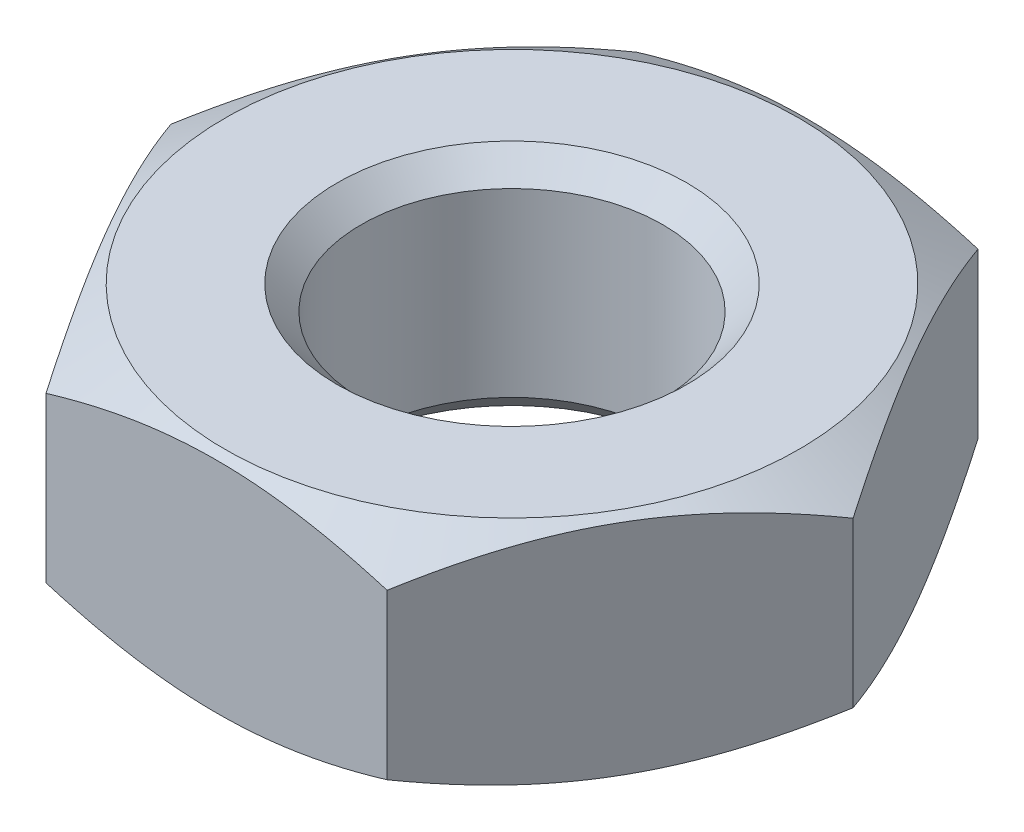
ISO-10303-21;
HEADER;
FILE_DESCRIPTION(('STEP AP214'),'2;1');
FILE_NAME('part.step','',(''),(''),'','','');
FILE_SCHEMA(('AUTOMOTIVE_DESIGN { 1 0 10303 214 1 1 1 1 }'));
ENDSEC;
DATA;
#1=APPLICATION_CONTEXT('core data for automotive mechanical design processes');
#2=APPLICATION_PROTOCOL_DEFINITION('international standard','automotive_design',2000,#1);
#3=PRODUCT_CONTEXT('',#1,'mechanical');
#4=PRODUCT('Part','Part','',(#3));
#5=PRODUCT_RELATED_PRODUCT_CATEGORY('part','',(#4));
#6=PRODUCT_DEFINITION_FORMATION('','',#4);
#7=PRODUCT_DEFINITION_CONTEXT('part definition',#1,'design');
#8=PRODUCT_DEFINITION('design','',#6,#7);
#9=PRODUCT_DEFINITION_SHAPE('','',#8);
#10=(LENGTH_UNIT() NAMED_UNIT(*) SI_UNIT(.MILLI.,.METRE.));
#11=(NAMED_UNIT(*) PLANE_ANGLE_UNIT() SI_UNIT($,.RADIAN.));
#12=(NAMED_UNIT(*) SI_UNIT($,.STERADIAN.) SOLID_ANGLE_UNIT());
#13=UNCERTAINTY_MEASURE_WITH_UNIT(LENGTH_MEASURE(1.E-05),#10,'distance_accuracy_value','');
#14=(GEOMETRIC_REPRESENTATION_CONTEXT(3) GLOBAL_UNCERTAINTY_ASSIGNED_CONTEXT((#13)) GLOBAL_UNIT_ASSIGNED_CONTEXT((#10,
#11,#12)) REPRESENTATION_CONTEXT('',''));
#15=CARTESIAN_POINT('',(0.,0.,0.));
#16=DIRECTION('',(0.,0.,1.));
#17=DIRECTION('',(1.,0.,0.));
#18=AXIS2_PLACEMENT_3D('',#15,#16,#17);
#19=CARTESIAN_POINT('',(2.82901631902917,1.9,0.));
#20=DIRECTION('',(-0.866025403784439,0.,0.5));
#21=DIRECTION('',(0.5,0.,0.866025403784439));
#22=AXIS2_PLACEMENT_3D('',#19,#20,#21);
#23=PLANE('',#22);
#24=CARTESIAN_POINT('',(1.41439268946075,0.269479077691386,-2.4502));
#25=CARTESIAN_POINT('',(1.47677048727323,0.232037910406293,-2.34215848492451));
#26=CARTESIAN_POINT('',(1.53972982554804,0.197971428797421,-2.23310971222164));
#27=CARTESIAN_POINT('',(1.66682980742826,0.138523898437332,-2.012966085964));
#28=CARTESIAN_POINT('',(1.73097313207265,0.1131660291326,-1.90186658871354));
#29=CARTESIAN_POINT('',(1.85840058422626,0.0738243493865201,-1.68115576730444));
#30=CARTESIAN_POINT('',(1.92166178982028,0.0595544012183872,-1.57158414506753));
#31=CARTESIAN_POINT('',(2.04849895824281,0.0426896534368349,-1.35189572507154));
#32=CARTESIAN_POINT('',(2.11207437813323,0.0400790531879413,-1.24177986770881));
#33=CARTESIAN_POINT('',(2.23032522857202,0.0462962306337335,-1.03696338671059));
#34=CARTESIAN_POINT('',(2.28502252294005,0.0536006980268142,-0.942224893828605));
#35=CARTESIAN_POINT('',(2.39403070515459,0.0764915330489983,-0.753417183792306));
#36=CARTESIAN_POINT('',(2.44834114841855,0.0920862332349296,-0.659348736677532));
#37=CARTESIAN_POINT('',(2.55758561799563,0.130973350090561,-0.470131764924119));
#38=CARTESIAN_POINT('',(2.61250370477718,0.154440199924583,-0.375010848364003));
#39=CARTESIAN_POINT('',(2.72146175961591,0.207610235260091,-0.186289961489444));
#40=CARTESIAN_POINT('',(2.77550335145968,0.237300005792712,-0.0926871786941389));
#41=CARTESIAN_POINT('',(2.829131789083,0.269479077691386,0.000200000000000194));
#42=B_SPLINE_CURVE_WITH_KNOTS('',3,(#24,#25,#26,#27,#28,#29,#30,#31,#32,#33,#34,#35,#36,#37,#38,
#39,#40,#41),.UNSPECIFIED.,.F.,.F.,(4,2,2,2,2,2,2,2,4),(0.,0.390930451950395,0.782893510352567,
1.16437050859214,1.54533037571847,1.87391217020586,2.20282485015241,2.53956853532258,
2.87559362214075),.UNSPECIFIED.);
#43=CARTESIAN_POINT('',(1.41450815951458,0.269409791417499,-2.45));
#44=VERTEX_POINT('',#43);
#45=CARTESIAN_POINT('',(2.82901631902917,0.269409791417499,0.));
#46=VERTEX_POINT('',#45);
#47=EDGE_CURVE('E47',#44,#46,#42,.T.);
#48=ORIENTED_EDGE('',*,*,#47,.F.);
#49=DIRECTION('',(0.,-1.,0.));
#50=VECTOR('',#49,1.);
#51=CARTESIAN_POINT('',(1.41450815951458,1.9,-2.45));
#52=LINE('',#51,#50);
#53=CARTESIAN_POINT('',(1.41450815951458,1.6305902085825,-2.45));
#54=VERTEX_POINT('',#53);
#55=EDGE_CURVE('E117',#54,#44,#52,.T.);
#56=ORIENTED_EDGE('',*,*,#55,.F.);
#57=CARTESIAN_POINT('',(2.829131789083,1.63052092230861,0.000199999999999789));
#58=CARTESIAN_POINT('',(2.76675399127052,1.66796208959371,-0.107841515075488));
#59=CARTESIAN_POINT('',(2.70379465299571,1.70202857120258,-0.216890287778362));
#60=CARTESIAN_POINT('',(2.57669467111549,1.76147610156267,-0.437033914036));
#61=CARTESIAN_POINT('',(2.5125513464711,1.7868339708674,-0.548133411286461));
#62=CARTESIAN_POINT('',(2.38512389431749,1.82617565061348,-0.768844232695565));
#63=CARTESIAN_POINT('',(2.32186268872347,1.84044559878161,-0.878415854932469));
#64=CARTESIAN_POINT('',(2.19502552030094,1.85731034656316,-1.09810427492846));
#65=CARTESIAN_POINT('',(2.13145010041052,1.85992094681206,-1.20822013229119));
#66=CARTESIAN_POINT('',(2.01319924997173,1.85370376936627,-1.41303661328941));
#67=CARTESIAN_POINT('',(1.95850195560369,1.84639930197319,-1.5077751061714));
#68=CARTESIAN_POINT('',(1.84949377338916,1.823508466951,-1.69658281620769));
#69=CARTESIAN_POINT('',(1.7951833301252,1.80791376676507,-1.79065126332247));
#70=CARTESIAN_POINT('',(1.68593886054812,1.76902664990944,-1.97986823507588));
#71=CARTESIAN_POINT('',(1.63102077376657,1.74555980007542,-2.074989151636));
#72=CARTESIAN_POINT('',(1.52206271892784,1.69238976473991,-2.26371003851056));
#73=CARTESIAN_POINT('',(1.46802112708407,1.66269999420729,-2.35731282130586));
#74=CARTESIAN_POINT('',(1.41439268946075,1.63052092230861,-2.4502));
#75=B_SPLINE_CURVE_WITH_KNOTS('',3,(#57,#58,#59,#60,#61,#62,#63,#64,#65,#66,#67,#68,#69,#70,#71,
#72,#73,#74),.UNSPECIFIED.,.F.,.F.,(4,2,2,2,2,2,2,2,4),(0.,0.390930451950395,0.782893510352568,
1.16437050859214,1.54533037571847,1.87391217020586,2.20282485015241,2.53956853532257,
2.87559362214075),.UNSPECIFIED.);
#76=CARTESIAN_POINT('',(2.82901631902917,1.6305902085825,0.));
#77=VERTEX_POINT('',#76);
#78=EDGE_CURVE('E108',#77,#54,#75,.T.);
#79=ORIENTED_EDGE('',*,*,#78,.F.);
#80=DIRECTION('',(0.,-1.,0.));
#81=VECTOR('',#80,1.);
#82=CARTESIAN_POINT('',(2.82901631902917,1.9,0.));
#83=LINE('',#82,#81);
#84=EDGE_CURVE('E104',#77,#46,#83,.T.);
#85=ORIENTED_EDGE('',*,*,#84,.T.);
#86=EDGE_LOOP('',(#48,#56,#79,#85));
#87=FACE_BOUND('',#86,.T.);
#88=ADVANCED_FACE('F32',(#87),#23,.F.);
#89=CARTESIAN_POINT('',(1.41450815951458,1.9,-2.45));
#90=DIRECTION('',(0.,0.,1.));
#91=DIRECTION('',(1.,0.,0.));
#92=AXIS2_PLACEMENT_3D('',#89,#90,#91);
#93=PLANE('',#92);
#94=CARTESIAN_POINT('',(-3.74965817158845,1.25946667055679,-2.45));
#95=CARTESIAN_POINT('',(-3.64345047094786,1.20613510680058,-2.45));
#96=CARTESIAN_POINT('',(-3.53697874802981,1.15332005100741,-2.45));
#97=CARTESIAN_POINT('',(-3.32336592279351,1.0490154886803,-2.45));
#98=CARTESIAN_POINT('',(-3.2162247078537,0.99752621305883,-2.45));
#99=CARTESIAN_POINT('',(-3.00051382017138,0.895876027771141,-2.45));
#100=CARTESIAN_POINT('',(-2.89193942229057,0.845725109514678,-2.45));
#101=CARTESIAN_POINT('',(-2.67385403861369,0.74751083227892,-2.45));
#102=CARTESIAN_POINT('',(-2.5643431018483,0.699447364806317,-2.45));
#103=CARTESIAN_POINT('',(-2.34057422323623,0.604426981862556,-2.45));
#104=CARTESIAN_POINT('',(-2.2262785695557,0.557558372763724,-2.45));
#105=CARTESIAN_POINT('',(-1.99623638020699,0.46745537366498,-2.45));
#106=CARTESIAN_POINT('',(-1.88048966524834,0.424221437947057,-2.45));
#107=CARTESIAN_POINT('',(-1.64759130543018,0.342574154345374,-2.45));
#108=CARTESIAN_POINT('',(-1.53044352596853,0.304149895949921,-2.45));
#109=CARTESIAN_POINT('',(-1.29433876808548,0.233400192223775,-2.45));
#110=CARTESIAN_POINT('',(-1.17538244323992,0.201072597738074,-2.45));
#111=CARTESIAN_POINT('',(-0.936248618339036,0.144307521694283,-2.45));
#112=CARTESIAN_POINT('',(-0.816081262787486,0.119828131680302,-2.45));
#113=CARTESIAN_POINT('',(-0.574190697315577,0.0802196754536274,-2.45));
#114=CARTESIAN_POINT('',(-0.452467673362204,0.065089502097277,-2.45));
#115=CARTESIAN_POINT('',(-0.209805936951998,0.0456422119090667,-2.45));
#116=CARTESIAN_POINT('',(-0.0888791611051035,0.0411804687620898,-2.45));
#117=CARTESIAN_POINT('',(0.152887770740793,0.0430703633886867,-2.45));
#118=CARTESIAN_POINT('',(0.27372792144189,0.0494226140573907,-2.45));
#119=CARTESIAN_POINT('',(0.558349692414668,0.0765532407295613,-2.45));
#120=CARTESIAN_POINT('',(0.721709684094118,0.101750081397433,-2.45));
#121=CARTESIAN_POINT('',(1.04528974419411,0.167569614340639,-2.45));
#122=CARTESIAN_POINT('',(1.20550676454216,0.208206571253317,-2.45));
#123=CARTESIAN_POINT('',(1.52611368035503,0.301774145522821,-2.45));
#124=CARTESIAN_POINT('',(1.68642768077093,0.354958817124725,-2.45));
#125=CARTESIAN_POINT('',(1.92457976432746,0.440931849372645,-2.45));
#126=CARTESIAN_POINT('',(2.0035692256735,0.470618794009118,-2.45));
#127=CARTESIAN_POINT('',(2.16087088700274,0.531738644426897,-2.45));
#128=CARTESIAN_POINT('',(2.23918309396597,0.563171532189061,-2.45));
#129=CARTESIAN_POINT('',(2.4214939156358,0.638334492541294,-2.45));
#130=CARTESIAN_POINT('',(2.52525497130904,0.682638901859946,-2.45));
#131=CARTESIAN_POINT('',(2.73186713521386,0.773325827126975,-2.45));
#132=CARTESIAN_POINT('',(2.83471819386625,0.819708455477802,-2.45));
#133=CARTESIAN_POINT('',(3.14216600862896,0.961353324877158,-2.45));
#134=CARTESIAN_POINT('',(3.34561855059338,1.05909614792049,-2.45));
#135=CARTESIAN_POINT('',(3.7505589779633,1.25903806453218,-2.45));
#136=CARTESIAN_POINT('',(3.95204462679496,1.36124163924887,-2.45));
#137=CARTESIAN_POINT('',(4.35345544644994,1.56867914549342,-2.45));
#138=CARTESIAN_POINT('',(4.5533805582734,1.67391319089693,-2.45));
#139=CARTESIAN_POINT('',(4.93559502677893,1.87775522597873,-2.45));
#140=CARTESIAN_POINT('',(5.1179760863135,1.97619186372367,-2.45));
#141=CARTESIAN_POINT('',(5.48199357726826,2.17444559462782,-2.45));
#142=CARTESIAN_POINT('',(5.66362998309839,2.27426273472099,-2.45));
#143=CARTESIAN_POINT('',(6.0258580716348,2.47470190474834,-2.45));
#144=CARTESIAN_POINT('',(6.20645123441132,2.57532126398378,-2.45));
#145=CARTESIAN_POINT('',(6.56715675779926,2.77739495755207,-2.45));
#146=CARTESIAN_POINT('',(6.74726914472722,2.87884924488802,-2.45));
#147=CARTESIAN_POINT('',(6.92720263028763,2.98061759071741,-2.45));
#148=B_SPLINE_CURVE_WITH_KNOTS('',3,(#94,#95,#96,#97,#98,#99,#100,#101,#102,#103,#104,#105,#106,
#107,#108,#109,#110,#111,#112,#113,#114,#115,#116,#117,#118,#119,#120,#121,#122,#123,#124,#125,
#126,#127,#128,#129,#130,#131,#132,#133,#134,#135,#136,#137,#138,#139,#140,#141,#142,#143,#144,
#145,#146,#147),.UNSPECIFIED.,.F.,.F.,(4,2,2,2,2,2,2,2,2,2,2,2,2,2,2,2,2,2,2,2,2,2,2,2,2,2,4),
(0.,0.356542298085689,0.713146281105163,1.07192052730746,1.4306761041833,1.80122435227199,
2.171818844931,2.54155681082086,2.91116419453753,3.27876371206765,3.64631968974574,
4.00886392897729,4.37142871649101,4.86630030080189,5.36163019748098,5.86801133712745,
6.12114935103962,6.37428475290656,6.71272715337824,7.05118788097696,7.72823578665523,
8.40598023780483,9.08375018980143,9.70549368889068,10.327258378069,10.9474521827674,
11.567611313223),.UNSPECIFIED.);
#149=CARTESIAN_POINT('',(-1.41450815951458,0.269409791417499,-2.45));
#150=VERTEX_POINT('',#149);
#151=EDGE_CURVE('E179',#150,#44,#148,.T.);
#152=ORIENTED_EDGE('',*,*,#151,.F.);
#153=DIRECTION('',(0.,-1.,0.));
#154=VECTOR('',#153,1.);
#155=CARTESIAN_POINT('',(-1.41450815951458,1.9,-2.45));
#156=LINE('',#155,#154);
#157=CARTESIAN_POINT('',(-1.41450815951458,1.6305902085825,-2.45));
#158=VERTEX_POINT('',#157);
#159=EDGE_CURVE('E114',#158,#150,#156,.T.);
#160=ORIENTED_EDGE('',*,*,#159,.F.);
#161=CARTESIAN_POINT('',(-3.74965817158845,0.640533329443206,-2.45));
#162=CARTESIAN_POINT('',(-3.64345047094786,0.693864893199416,-2.45));
#163=CARTESIAN_POINT('',(-3.53697874802981,0.746679948992588,-2.45));
#164=CARTESIAN_POINT('',(-3.32336592279351,0.850984511319699,-2.45));
#165=CARTESIAN_POINT('',(-3.2162247078537,0.902473786941169,-2.45));
#166=CARTESIAN_POINT('',(-3.00051382017138,1.00412397222886,-2.45));
#167=CARTESIAN_POINT('',(-2.89193942229057,1.05427489048532,-2.45));
#168=CARTESIAN_POINT('',(-2.67385403861369,1.15248916772108,-2.45));
#169=CARTESIAN_POINT('',(-2.56434310184831,1.20055263519368,-2.45));
#170=CARTESIAN_POINT('',(-2.34057422323623,1.29557301813744,-2.45));
#171=CARTESIAN_POINT('',(-2.2262785695557,1.34244162723627,-2.45));
#172=CARTESIAN_POINT('',(-1.99623638020699,1.43254462633502,-2.45));
#173=CARTESIAN_POINT('',(-1.88048966524834,1.47577856205294,-2.45));
#174=CARTESIAN_POINT('',(-1.64759130543018,1.55742584565463,-2.45));
#175=CARTESIAN_POINT('',(-1.53044352596853,1.59585010405008,-2.45));
#176=CARTESIAN_POINT('',(-1.29433876808548,1.66659980777622,-2.45));
#177=CARTESIAN_POINT('',(-1.17538244323992,1.69892740226193,-2.45));
#178=CARTESIAN_POINT('',(-0.936248618339036,1.75569247830572,-2.45));
#179=CARTESIAN_POINT('',(-0.816081262787486,1.7801718683197,-2.45));
#180=CARTESIAN_POINT('',(-0.574190697315577,1.81978032454637,-2.45));
#181=CARTESIAN_POINT('',(-0.452467673362204,1.83491049790272,-2.45));
#182=CARTESIAN_POINT('',(-0.209805936951998,1.85435778809093,-2.45));
#183=CARTESIAN_POINT('',(-0.0888791611051034,1.85881953123791,-2.45));
#184=CARTESIAN_POINT('',(0.152887770740793,1.85692963661131,-2.45));
#185=CARTESIAN_POINT('',(0.273727921441891,1.85057738594261,-2.45));
#186=CARTESIAN_POINT('',(0.558349692414669,1.82344675927044,-2.45));
#187=CARTESIAN_POINT('',(0.721709684094119,1.79824991860257,-2.45));
#188=CARTESIAN_POINT('',(1.04528974419411,1.73243038565936,-2.45));
#189=CARTESIAN_POINT('',(1.20550676454216,1.69179342874668,-2.45));
#190=CARTESIAN_POINT('',(1.52611368035503,1.59822585447718,-2.45));
#191=CARTESIAN_POINT('',(1.68642768077093,1.54504118287527,-2.45));
#192=CARTESIAN_POINT('',(1.92457976432746,1.45906815062735,-2.45));
#193=CARTESIAN_POINT('',(2.0035692256735,1.42938120599088,-2.45));
#194=CARTESIAN_POINT('',(2.16087088700274,1.3682613555731,-2.45));
#195=CARTESIAN_POINT('',(2.23918309396597,1.33682846781094,-2.45));
#196=CARTESIAN_POINT('',(2.4214939156358,1.26166550745871,-2.45));
#197=CARTESIAN_POINT('',(2.52525497130904,1.21736109814005,-2.45));
#198=CARTESIAN_POINT('',(2.73186713521386,1.12667417287302,-2.45));
#199=CARTESIAN_POINT('',(2.83471819386625,1.0802915445222,-2.45));
#200=CARTESIAN_POINT('',(3.14216600862896,0.938646675122841,-2.45));
#201=CARTESIAN_POINT('',(3.34561855059337,0.840903852079506,-2.45));
#202=CARTESIAN_POINT('',(3.7505589779633,0.640961935467822,-2.45));
#203=CARTESIAN_POINT('',(3.95204462679495,0.538758360751125,-2.45));
#204=CARTESIAN_POINT('',(4.35345544644994,0.331320854506581,-2.45));
#205=CARTESIAN_POINT('',(4.5533805582734,0.226086809103066,-2.45));
#206=CARTESIAN_POINT('',(4.93559502677893,0.0222447740212691,-2.45));
#207=CARTESIAN_POINT('',(5.1179760863135,-0.0761918637236669,-2.45));
#208=CARTESIAN_POINT('',(5.48199357726825,-0.274445594627817,-2.45));
#209=CARTESIAN_POINT('',(5.66362998309838,-0.374262734720988,-2.45));
#210=CARTESIAN_POINT('',(6.02585807163479,-0.574701904748339,-2.45));
#211=CARTESIAN_POINT('',(6.20645123441132,-0.675321263983782,-2.45));
#212=CARTESIAN_POINT('',(6.56715675779926,-0.877394957552073,-2.45));
#213=CARTESIAN_POINT('',(6.74726914472721,-0.978849244888017,-2.45));
#214=CARTESIAN_POINT('',(6.92720263028763,-1.08061759071741,-2.45));
#215=B_SPLINE_CURVE_WITH_KNOTS('',3,(#161,#162,#163,#164,#165,#166,#167,#168,#169,#170,#171,
#172,#173,#174,#175,#176,#177,#178,#179,#180,#181,#182,#183,#184,#185,#186,#187,#188,#189,#190,
#191,#192,#193,#194,#195,#196,#197,#198,#199,#200,#201,#202,#203,#204,#205,#206,#207,#208,#209,
#210,#211,#212,#213,#214),.UNSPECIFIED.,.F.,.F.,(4,2,2,2,2,2,2,2,2,2,2,2,2,2,2,2,2,2,2,2,2,2,2,
2,2,2,4),(0.,0.356542298085688,0.713146281105162,1.07192052730746,1.4306761041833,
1.80122435227199,2.171818844931,2.54155681082086,2.91116419453753,3.27876371206765,
3.64631968974574,4.00886392897729,4.37142871649101,4.86630030080189,5.36163019748098,
5.86801133712745,6.12114935103962,6.37428475290656,6.71272715337824,7.05118788097696,
7.72823578665523,8.40598023780483,9.08375018980143,9.70549368889067,10.327258378069,
10.9474521827674,11.567611313223),.UNSPECIFIED.);
#216=EDGE_CURVE('E198',#54,#158,#215,.F.);
#217=ORIENTED_EDGE('',*,*,#216,.F.);
#218=ORIENTED_EDGE('',*,*,#55,.T.);
#219=EDGE_LOOP('',(#152,#160,#217,#218));
#220=FACE_BOUND('',#219,.T.);
#221=ADVANCED_FACE('F189',(#220),#93,.F.);
#222=CARTESIAN_POINT('',(-1.41450815951458,1.9,-2.45));
#223=DIRECTION('',(0.866025403784439,0.,0.5));
#224=DIRECTION('',(0.5,0.,-0.866025403784439));
#225=AXIS2_PLACEMENT_3D('',#222,#223,#224);
#226=PLANE('',#225);
#227=CARTESIAN_POINT('',(-2.829131789083,0.269479077691386,0.000199999999999772));
#228=CARTESIAN_POINT('',(-2.76675399127052,0.232037910406293,-0.107841515075488));
#229=CARTESIAN_POINT('',(-2.70379465299571,0.197971428797421,-0.216890287778362));
#230=CARTESIAN_POINT('',(-2.57669467111549,0.138523898437332,-0.437033914036));
#231=CARTESIAN_POINT('',(-2.5125513464711,0.1131660291326,-0.548133411286461));
#232=CARTESIAN_POINT('',(-2.38512389431749,0.0738243493865202,-0.768844232695565));
#233=CARTESIAN_POINT('',(-2.32186268872347,0.0595544012183871,-0.878415854932469));
#234=CARTESIAN_POINT('',(-2.19502552030094,0.0426896534368349,-1.09810427492846));
#235=CARTESIAN_POINT('',(-2.13145010041052,0.0400790531879415,-1.20822013229119));
#236=CARTESIAN_POINT('',(-2.01319924997173,0.0462962306337337,-1.41303661328941));
#237=CARTESIAN_POINT('',(-1.9585019556037,0.0536006980268142,-1.5077751061714));
#238=CARTESIAN_POINT('',(-1.84949377338916,0.0764915330489982,-1.69658281620769));
#239=CARTESIAN_POINT('',(-1.7951833301252,0.0920862332349297,-1.79065126332247));
#240=CARTESIAN_POINT('',(-1.68593886054812,0.130973350090561,-1.97986823507588));
#241=CARTESIAN_POINT('',(-1.63102077376657,0.154440199924583,-2.074989151636));
#242=CARTESIAN_POINT('',(-1.52206271892784,0.207610235260091,-2.26371003851056));
#243=CARTESIAN_POINT('',(-1.46802112708407,0.237300005792712,-2.35731282130586));
#244=CARTESIAN_POINT('',(-1.41439268946075,0.269479077691385,-2.4502));
#245=B_SPLINE_CURVE_WITH_KNOTS('',3,(#227,#228,#229,#230,#231,#232,#233,#234,#235,#236,#237,
#238,#239,#240,#241,#242,#243,#244),.UNSPECIFIED.,.F.,.F.,(4,2,2,2,2,2,2,2,4),(0.,
0.390930451950394,0.782893510352567,1.16437050859214,1.54533037571847,1.87391217020586,
2.20282485015241,2.53956853532258,2.87559362214075),.UNSPECIFIED.);
#246=CARTESIAN_POINT('',(-2.82901631902917,0.269409791417499,0.));
#247=VERTEX_POINT('',#246);
#248=EDGE_CURVE('E173',#247,#150,#245,.T.);
#249=ORIENTED_EDGE('',*,*,#248,.F.);
#250=DIRECTION('',(0.,-1.,0.));
#251=VECTOR('',#250,1.);
#252=CARTESIAN_POINT('',(-2.82901631902917,1.9,0.));
#253=LINE('',#252,#251);
#254=CARTESIAN_POINT('',(-2.82901631902917,1.6305902085825,0.));
#255=VERTEX_POINT('',#254);
#256=EDGE_CURVE('E106',#255,#247,#253,.T.);
#257=ORIENTED_EDGE('',*,*,#256,.F.);
#258=CARTESIAN_POINT('',(-1.41439268946075,1.63052092230861,-2.4502));
#259=CARTESIAN_POINT('',(-1.47677048727323,1.66796208959371,-2.34215848492451));
#260=CARTESIAN_POINT('',(-1.53972982554804,1.70202857120258,-2.23310971222164));
#261=CARTESIAN_POINT('',(-1.66682980742826,1.76147610156267,-2.012966085964));
#262=CARTESIAN_POINT('',(-1.73097313207265,1.7868339708674,-1.90186658871354));
#263=CARTESIAN_POINT('',(-1.85840058422626,1.82617565061348,-1.68115576730444));
#264=CARTESIAN_POINT('',(-1.92166178982028,1.84044559878161,-1.57158414506753));
#265=CARTESIAN_POINT('',(-2.04849895824281,1.85731034656316,-1.35189572507154));
#266=CARTESIAN_POINT('',(-2.11207437813323,1.85992094681206,-1.24177986770881));
#267=CARTESIAN_POINT('',(-2.23032522857202,1.85370376936627,-1.03696338671059));
#268=CARTESIAN_POINT('',(-2.28502252294006,1.84639930197319,-0.942224893828605));
#269=CARTESIAN_POINT('',(-2.39403070515459,1.823508466951,-0.753417183792307));
#270=CARTESIAN_POINT('',(-2.44834114841855,1.80791376676507,-0.659348736677532));
#271=CARTESIAN_POINT('',(-2.55758561799563,1.76902664990944,-0.470131764924119));
#272=CARTESIAN_POINT('',(-2.61250370477718,1.74555980007542,-0.375010848364003));
#273=CARTESIAN_POINT('',(-2.72146175961591,1.69238976473991,-0.186289961489444));
#274=CARTESIAN_POINT('',(-2.77550335145968,1.66269999420729,-0.0926871786941388));
#275=CARTESIAN_POINT('',(-2.829131789083,1.63052092230861,0.000200000000000019));
#276=B_SPLINE_CURVE_WITH_KNOTS('',3,(#258,#259,#260,#261,#262,#263,#264,#265,#266,#267,#268,
#269,#270,#271,#272,#273,#274,#275),.UNSPECIFIED.,.F.,.F.,(4,2,2,2,2,2,2,2,4),(0.,
0.390930451950395,0.782893510352567,1.16437050859214,1.54533037571847,1.87391217020586,
2.20282485015241,2.53956853532258,2.87559362214075),.UNSPECIFIED.);
#277=EDGE_CURVE('E203',#158,#255,#276,.T.);
#278=ORIENTED_EDGE('',*,*,#277,.F.);
#279=ORIENTED_EDGE('',*,*,#159,.T.);
#280=EDGE_LOOP('',(#249,#257,#278,#279));
#281=FACE_BOUND('',#280,.T.);
#282=ADVANCED_FACE('F192',(#281),#226,.F.);
#283=CARTESIAN_POINT('',(-2.82901631902917,1.9,0.));
#284=DIRECTION('',(0.866025403784439,0.,-0.5));
#285=DIRECTION('',(-0.5,0.,-0.866025403784439));
#286=AXIS2_PLACEMENT_3D('',#283,#284,#285);
#287=PLANE('',#286);
#288=CARTESIAN_POINT('',(-1.41439268946074,0.269479077691386,2.4502));
#289=CARTESIAN_POINT('',(-1.47677048727323,0.232037910406293,2.34215848492451));
#290=CARTESIAN_POINT('',(-1.53972982554803,0.197971428797421,2.23310971222164));
#291=CARTESIAN_POINT('',(-1.66682980742826,0.138523898437331,2.012966085964));
#292=CARTESIAN_POINT('',(-1.73097313207265,0.1131660291326,1.90186658871354));
#293=CARTESIAN_POINT('',(-1.85840058422626,0.0738243493865198,1.68115576730444));
#294=CARTESIAN_POINT('',(-1.92166178982028,0.0595544012183868,1.57158414506753));
#295=CARTESIAN_POINT('',(-2.04849895824281,0.0426896534368346,1.35189572507154));
#296=CARTESIAN_POINT('',(-2.11207437813323,0.0400790531879412,1.24177986770881));
#297=CARTESIAN_POINT('',(-2.23032522857202,0.0462962306337333,1.0369633867106));
#298=CARTESIAN_POINT('',(-2.28502252294005,0.0536006980268139,0.942224893828606));
#299=CARTESIAN_POINT('',(-2.39403070515459,0.0764915330489979,0.753417183792307));
#300=CARTESIAN_POINT('',(-2.44834114841855,0.0920862332349294,0.659348736677532));
#301=CARTESIAN_POINT('',(-2.55758561799563,0.130973350090561,0.470131764924119));
#302=CARTESIAN_POINT('',(-2.61250370477718,0.154440199924583,0.375010848364003));
#303=CARTESIAN_POINT('',(-2.72146175961591,0.207610235260091,0.186289961489444));
#304=CARTESIAN_POINT('',(-2.77550335145968,0.237300005792712,0.0926871786941384));
#305=CARTESIAN_POINT('',(-2.829131789083,0.269479077691386,-0.000200000000000661));
#306=B_SPLINE_CURVE_WITH_KNOTS('',3,(#288,#289,#290,#291,#292,#293,#294,#295,#296,#297,#298,
#299,#300,#301,#302,#303,#304,#305),.UNSPECIFIED.,.F.,.F.,(4,2,2,2,2,2,2,2,4),(0.,
0.390930451950395,0.782893510352567,1.16437050859214,1.54533037571847,1.87391217020586,
2.20282485015241,2.53956853532258,2.87559362214075),.UNSPECIFIED.);
#307=CARTESIAN_POINT('',(-1.41450815951595,0.269409791416633,2.45));
#308=VERTEX_POINT('',#307);
#309=EDGE_CURVE('E100',#308,#247,#306,.T.);
#310=ORIENTED_EDGE('',*,*,#309,.F.);
#311=DIRECTION('',(0.,-1.,0.));
#312=VECTOR('',#311,1.);
#313=CARTESIAN_POINT('',(-1.41450815951458,1.9,2.45));
#314=LINE('',#313,#312);
#315=CARTESIAN_POINT('',(-1.41450815951595,1.63059020858337,2.45));
#316=VERTEX_POINT('',#315);
#317=EDGE_CURVE('E99',#316,#308,#314,.T.);
#318=ORIENTED_EDGE('',*,*,#317,.F.);
#319=CARTESIAN_POINT('',(-2.829131789083,1.63052092230861,-0.000200000000000254));
#320=CARTESIAN_POINT('',(-2.76675399127052,1.66796208959371,0.107841515075488));
#321=CARTESIAN_POINT('',(-2.70379465299571,1.70202857120258,0.216890287778361));
#322=CARTESIAN_POINT('',(-2.57669467111549,1.76147610156267,0.437033914035999));
#323=CARTESIAN_POINT('',(-2.5125513464711,1.7868339708674,0.54813341128646));
#324=CARTESIAN_POINT('',(-2.38512389431749,1.82617565061348,0.768844232695564));
#325=CARTESIAN_POINT('',(-2.32186268872347,1.84044559878161,0.878415854932468));
#326=CARTESIAN_POINT('',(-2.19502552030094,1.85731034656316,1.09810427492846));
#327=CARTESIAN_POINT('',(-2.13145010041052,1.85992094681206,1.20822013229119));
#328=CARTESIAN_POINT('',(-2.01319924997173,1.85370376936627,1.41303661328941));
#329=CARTESIAN_POINT('',(-1.95850195560369,1.84639930197319,1.5077751061714));
#330=CARTESIAN_POINT('',(-1.84949377338916,1.823508466951,1.69658281620769));
#331=CARTESIAN_POINT('',(-1.7951833301252,1.80791376676507,1.79065126332247));
#332=CARTESIAN_POINT('',(-1.68593886054812,1.76902664990944,1.97986823507588));
#333=CARTESIAN_POINT('',(-1.63102077376657,1.74555980007542,2.074989151636));
#334=CARTESIAN_POINT('',(-1.52206271892784,1.69238976473991,2.26371003851056));
#335=CARTESIAN_POINT('',(-1.46802112708407,1.66269999420729,2.35731282130586));
#336=CARTESIAN_POINT('',(-1.41439268946074,1.63052092230861,2.4502));
#337=B_SPLINE_CURVE_WITH_KNOTS('',3,(#319,#320,#321,#322,#323,#324,#325,#326,#327,#328,#329,
#330,#331,#332,#333,#334,#335,#336),.UNSPECIFIED.,.F.,.F.,(4,2,2,2,2,2,2,2,4),(0.,
0.390930451950394,0.782893510352567,1.16437050859214,1.54533037571847,1.87391217020586,
2.20282485015241,2.53956853532258,2.87559362214075),.UNSPECIFIED.);
#338=EDGE_CURVE('E230',#255,#316,#337,.T.);
#339=ORIENTED_EDGE('',*,*,#338,.F.);
#340=ORIENTED_EDGE('',*,*,#256,.T.);
#341=EDGE_LOOP('',(#310,#318,#339,#340));
#342=FACE_BOUND('',#341,.T.);
#343=ADVANCED_FACE('F236',(#342),#287,.F.);
#344=CARTESIAN_POINT('',(-1.41450815951458,1.9,2.45));
#345=DIRECTION('',(0.,0.,-1.));
#346=DIRECTION('',(-1.,0.,0.));
#347=AXIS2_PLACEMENT_3D('',#344,#345,#346);
#348=PLANE('',#347);
#349=CARTESIAN_POINT('',(-3.74965817158845,1.25946667055679,2.45));
#350=CARTESIAN_POINT('',(-3.64345047094786,1.20613510680058,2.45));
#351=CARTESIAN_POINT('',(-3.53697874802981,1.15332005100741,2.45));
#352=CARTESIAN_POINT('',(-3.32336592279351,1.0490154886803,2.45));
#353=CARTESIAN_POINT('',(-3.2162247078537,0.99752621305883,2.45));
#354=CARTESIAN_POINT('',(-3.00051382017138,0.895876027771142,2.45));
#355=CARTESIAN_POINT('',(-2.89193942229057,0.845725109514679,2.45));
#356=CARTESIAN_POINT('',(-2.67385403861369,0.747510832278921,2.45));
#357=CARTESIAN_POINT('',(-2.5643431018483,0.699447364806318,2.45));
#358=CARTESIAN_POINT('',(-2.34057422323623,0.604426981862556,2.45));
#359=CARTESIAN_POINT('',(-2.2262785695557,0.557558372763724,2.45));
#360=CARTESIAN_POINT('',(-1.99623638020699,0.46745537366498,2.45));
#361=CARTESIAN_POINT('',(-1.88048966524834,0.424221437947058,2.45));
#362=CARTESIAN_POINT('',(-1.64759130543018,0.342574154345374,2.45));
#363=CARTESIAN_POINT('',(-1.53044352596853,0.304149895949921,2.45));
#364=CARTESIAN_POINT('',(-1.29433876808548,0.233400192223775,2.45));
#365=CARTESIAN_POINT('',(-1.17538244323992,0.201072597738074,2.45));
#366=CARTESIAN_POINT('',(-0.936248618339036,0.144307521694283,2.45));
#367=CARTESIAN_POINT('',(-0.816081262787486,0.119828131680302,2.45));
#368=CARTESIAN_POINT('',(-0.574190697315577,0.0802196754536277,2.45));
#369=CARTESIAN_POINT('',(-0.452467673362205,0.0650895020972773,2.45));
#370=CARTESIAN_POINT('',(-0.209805936951999,0.0456422119090669,2.45));
#371=CARTESIAN_POINT('',(-0.0888791611051036,0.0411804687620901,2.45));
#372=CARTESIAN_POINT('',(0.152887770740793,0.043070363388687,2.45));
#373=CARTESIAN_POINT('',(0.27372792144189,0.0494226140573909,2.45));
#374=CARTESIAN_POINT('',(0.558349692414669,0.0765532407295616,2.45));
#375=CARTESIAN_POINT('',(0.721709684094119,0.101750081397434,2.45));
#376=CARTESIAN_POINT('',(1.04528974419412,0.16756961434064,2.45));
#377=CARTESIAN_POINT('',(1.20550676454216,0.208206571253318,2.45));
#378=CARTESIAN_POINT('',(1.52611368035503,0.301774145522821,2.45));
#379=CARTESIAN_POINT('',(1.68642768077093,0.354958817124726,2.45));
#380=CARTESIAN_POINT('',(1.92457976432746,0.440931849372646,2.45));
#381=CARTESIAN_POINT('',(2.0035692256735,0.470618794009119,2.45));
#382=CARTESIAN_POINT('',(2.16087088700275,0.531738644426898,2.45));
#383=CARTESIAN_POINT('',(2.23918309396597,0.563171532189062,2.45));
#384=CARTESIAN_POINT('',(2.4214939156358,0.638334492541296,2.45));
#385=CARTESIAN_POINT('',(2.52525497130904,0.682638901859947,2.45));
#386=CARTESIAN_POINT('',(2.73186713521386,0.773325827126976,2.45));
#387=CARTESIAN_POINT('',(2.83471819386625,0.819708455477802,2.45));
#388=CARTESIAN_POINT('',(3.14216600862896,0.961353324877158,2.45));
#389=CARTESIAN_POINT('',(3.34561855059338,1.05909614792049,2.45));
#390=CARTESIAN_POINT('',(3.7505589779633,1.25903806453218,2.45));
#391=CARTESIAN_POINT('',(3.95204462679496,1.36124163924887,2.45));
#392=CARTESIAN_POINT('',(4.35345544644994,1.56867914549342,2.45));
#393=CARTESIAN_POINT('',(4.5533805582734,1.67391319089693,2.45));
#394=CARTESIAN_POINT('',(4.93559502677893,1.87775522597873,2.45));
#395=CARTESIAN_POINT('',(5.1179760863135,1.97619186372367,2.45));
#396=CARTESIAN_POINT('',(5.48199357726826,2.17444559462782,2.45));
#397=CARTESIAN_POINT('',(5.66362998309838,2.27426273472099,2.45));
#398=CARTESIAN_POINT('',(6.02585807163479,2.47470190474834,2.45));
#399=CARTESIAN_POINT('',(6.20645123441132,2.57532126398378,2.45));
#400=CARTESIAN_POINT('',(6.56715675779926,2.77739495755207,2.45));
#401=CARTESIAN_POINT('',(6.74726914472722,2.87884924488802,2.45));
#402=CARTESIAN_POINT('',(6.92720263028763,2.98061759071741,2.45));
#403=B_SPLINE_CURVE_WITH_KNOTS('',3,(#349,#350,#351,#352,#353,#354,#355,#356,#357,#358,#359,
#360,#361,#362,#363,#364,#365,#366,#367,#368,#369,#370,#371,#372,#373,#374,#375,#376,#377,#378,
#379,#380,#381,#382,#383,#384,#385,#386,#387,#388,#389,#390,#391,#392,#393,#394,#395,#396,#397,
#398,#399,#400,#401,#402),.UNSPECIFIED.,.F.,.F.,(4,2,2,2,2,2,2,2,2,2,2,2,2,2,2,2,2,2,2,2,2,2,2,
2,2,2,4),(0.,0.356542298085689,0.713146281105163,1.07192052730746,1.4306761041833,
1.80122435227199,2.171818844931,2.54155681082086,2.91116419453753,3.27876371206765,
3.64631968974574,4.00886392897729,4.37142871649101,4.86630030080189,5.36163019748098,
5.86801133712745,6.12114935103962,6.37428475290656,6.71272715337824,7.05118788097697,
7.72823578665523,8.40598023780484,9.08375018980143,9.70549368889068,10.327258378069,
10.9474521827674,11.567611313223),.UNSPECIFIED.);
#404=CARTESIAN_POINT('',(1.41450815951458,0.269409791417499,2.45));
#405=VERTEX_POINT('',#404);
#406=EDGE_CURVE('E85',#405,#308,#403,.F.);
#407=ORIENTED_EDGE('',*,*,#406,.F.);
#408=DIRECTION('',(0.,-1.,0.));
#409=VECTOR('',#408,1.);
#410=CARTESIAN_POINT('',(1.41450815951458,1.9,2.45));
#411=LINE('',#410,#409);
#412=CARTESIAN_POINT('',(1.41450815951458,1.6305902085825,2.45));
#413=VERTEX_POINT('',#412);
#414=EDGE_CURVE('E97',#413,#405,#411,.T.);
#415=ORIENTED_EDGE('',*,*,#414,.F.);
#416=CARTESIAN_POINT('',(-3.74965817158845,0.640533329443206,2.45));
#417=CARTESIAN_POINT('',(-3.64345047094786,0.693864893199416,2.45));
#418=CARTESIAN_POINT('',(-3.53697874802981,0.746679948992588,2.45));
#419=CARTESIAN_POINT('',(-3.32336592279351,0.850984511319699,2.45));
#420=CARTESIAN_POINT('',(-3.2162247078537,0.902473786941169,2.45));
#421=CARTESIAN_POINT('',(-3.00051382017138,1.00412397222886,2.45));
#422=CARTESIAN_POINT('',(-2.89193942229056,1.05427489048532,2.45));
#423=CARTESIAN_POINT('',(-2.67385403861369,1.15248916772108,2.45));
#424=CARTESIAN_POINT('',(-2.5643431018483,1.20055263519368,2.45));
#425=CARTESIAN_POINT('',(-2.34057422323623,1.29557301813744,2.45));
#426=CARTESIAN_POINT('',(-2.2262785695557,1.34244162723627,2.45));
#427=CARTESIAN_POINT('',(-1.996236380207,1.43254462633502,2.45));
#428=CARTESIAN_POINT('',(-1.88048966524834,1.47577856205294,2.45));
#429=CARTESIAN_POINT('',(-1.64759130543018,1.55742584565463,2.45));
#430=CARTESIAN_POINT('',(-1.53044352596853,1.59585010405008,2.45));
#431=CARTESIAN_POINT('',(-1.29433876808548,1.66659980777622,2.45));
#432=CARTESIAN_POINT('',(-1.17538244323992,1.69892740226193,2.45));
#433=CARTESIAN_POINT('',(-0.936248618339035,1.75569247830572,2.45));
#434=CARTESIAN_POINT('',(-0.816081262787486,1.7801718683197,2.45));
#435=CARTESIAN_POINT('',(-0.574190697315576,1.81978032454637,2.45));
#436=CARTESIAN_POINT('',(-0.452467673362204,1.83491049790272,2.45));
#437=CARTESIAN_POINT('',(-0.209805936951998,1.85435778809093,2.45));
#438=CARTESIAN_POINT('',(-0.0888791611051033,1.85881953123791,2.45));
#439=CARTESIAN_POINT('',(0.152887770740793,1.85692963661131,2.45));
#440=CARTESIAN_POINT('',(0.273727921441891,1.85057738594261,2.45));
#441=CARTESIAN_POINT('',(0.558349692414669,1.82344675927044,2.45));
#442=CARTESIAN_POINT('',(0.721709684094119,1.79824991860257,2.45));
#443=CARTESIAN_POINT('',(1.04528974419411,1.73243038565936,2.45));
#444=CARTESIAN_POINT('',(1.20550676454216,1.69179342874668,2.45));
#445=CARTESIAN_POINT('',(1.52611368035503,1.59822585447718,2.45));
#446=CARTESIAN_POINT('',(1.68642768077093,1.54504118287527,2.45));
#447=CARTESIAN_POINT('',(1.92457976432746,1.45906815062735,2.45));
#448=CARTESIAN_POINT('',(2.0035692256735,1.42938120599088,2.45));
#449=CARTESIAN_POINT('',(2.16087088700274,1.3682613555731,2.45));
#450=CARTESIAN_POINT('',(2.23918309396597,1.33682846781094,2.45));
#451=CARTESIAN_POINT('',(2.4214939156358,1.2616655074587,2.45));
#452=CARTESIAN_POINT('',(2.52525497130904,1.21736109814005,2.45));
#453=CARTESIAN_POINT('',(2.73186713521386,1.12667417287302,2.45));
#454=CARTESIAN_POINT('',(2.83471819386625,1.0802915445222,2.45));
#455=CARTESIAN_POINT('',(3.14216600862896,0.938646675122841,2.45));
#456=CARTESIAN_POINT('',(3.34561855059337,0.840903852079506,2.45));
#457=CARTESIAN_POINT('',(3.7505589779633,0.640961935467823,2.45));
#458=CARTESIAN_POINT('',(3.95204462679495,0.538758360751126,2.45));
#459=CARTESIAN_POINT('',(4.35345544644994,0.331320854506581,2.45));
#460=CARTESIAN_POINT('',(4.5533805582734,0.226086809103066,2.45));
#461=CARTESIAN_POINT('',(4.93559502677893,0.022244774021269,2.45));
#462=CARTESIAN_POINT('',(5.1179760863135,-0.0761918637236669,2.45));
#463=CARTESIAN_POINT('',(5.48199357726825,-0.274445594627816,2.45));
#464=CARTESIAN_POINT('',(5.66362998309838,-0.374262734720987,2.45));
#465=CARTESIAN_POINT('',(6.02585807163479,-0.57470190474834,2.45));
#466=CARTESIAN_POINT('',(6.20645123441132,-0.675321263983783,2.45));
#467=CARTESIAN_POINT('',(6.56715675779926,-0.877394957552074,2.45));
#468=CARTESIAN_POINT('',(6.74726914472721,-0.978849244888018,2.45));
#469=CARTESIAN_POINT('',(6.92720263028763,-1.08061759071741,2.45));
#470=B_SPLINE_CURVE_WITH_KNOTS('',3,(#416,#417,#418,#419,#420,#421,#422,#423,#424,#425,#426,
#427,#428,#429,#430,#431,#432,#433,#434,#435,#436,#437,#438,#439,#440,#441,#442,#443,#444,#445,
#446,#447,#448,#449,#450,#451,#452,#453,#454,#455,#456,#457,#458,#459,#460,#461,#462,#463,#464,
#465,#466,#467,#468,#469),.UNSPECIFIED.,.F.,.F.,(4,2,2,2,2,2,2,2,2,2,2,2,2,2,2,2,2,2,2,2,2,2,2,
2,2,2,4),(0.,0.356542298085689,0.713146281105163,1.07192052730746,1.4306761041833,
1.80122435227199,2.171818844931,2.54155681082086,2.91116419453753,3.27876371206765,
3.64631968974574,4.00886392897729,4.37142871649101,4.86630030080189,5.36163019748097,
5.86801133712745,6.12114935103962,6.37428475290656,6.71272715337824,7.05118788097696,
7.72823578665523,8.40598023780483,9.08375018980142,9.70549368889067,10.327258378069,
10.9474521827674,11.567611313223),.UNSPECIFIED.);
#471=EDGE_CURVE('E55',#316,#413,#470,.T.);
#472=ORIENTED_EDGE('',*,*,#471,.F.);
#473=ORIENTED_EDGE('',*,*,#317,.T.);
#474=EDGE_LOOP('',(#407,#415,#472,#473));
#475=FACE_BOUND('',#474,.T.);
#476=ADVANCED_FACE('F96',(#475),#348,.F.);
#477=CARTESIAN_POINT('',(1.41450815951458,1.9,2.45));
#478=DIRECTION('',(-0.866025403784439,0.,-0.5));
#479=DIRECTION('',(-0.5,0.,0.866025403784439));
#480=AXIS2_PLACEMENT_3D('',#477,#478,#479);
#481=PLANE('',#480);
#482=CARTESIAN_POINT('',(2.829131789083,0.269479077691386,-0.000200000000000237));
#483=CARTESIAN_POINT('',(2.76675399127052,0.232037910406293,0.107841515075487));
#484=CARTESIAN_POINT('',(2.70379465299571,0.197971428797421,0.216890287778361));
#485=CARTESIAN_POINT('',(2.57669467111549,0.138523898437332,0.437033914035999));
#486=CARTESIAN_POINT('',(2.5125513464711,0.1131660291326,0.54813341128646));
#487=CARTESIAN_POINT('',(2.38512389431749,0.0738243493865199,0.768844232695564));
#488=CARTESIAN_POINT('',(2.32186268872347,0.0595544012183869,0.878415854932468));
#489=CARTESIAN_POINT('',(2.19502552030094,0.0426896534368347,1.09810427492846));
#490=CARTESIAN_POINT('',(2.13145010041052,0.0400790531879414,1.20822013229119));
#491=CARTESIAN_POINT('',(2.01319924997173,0.0462962306337334,1.4130366132894));
#492=CARTESIAN_POINT('',(1.9585019556037,0.0536006980268139,1.50777510617139));
#493=CARTESIAN_POINT('',(1.84949377338916,0.076491533048998,1.69658281620769));
#494=CARTESIAN_POINT('',(1.7951833301252,0.0920862332349296,1.79065126332247));
#495=CARTESIAN_POINT('',(1.68593886054812,0.130973350090561,1.97986823507588));
#496=CARTESIAN_POINT('',(1.63102077376657,0.154440199924583,2.074989151636));
#497=CARTESIAN_POINT('',(1.52206271892784,0.207610235260091,2.26371003851056));
#498=CARTESIAN_POINT('',(1.46802112708407,0.237300005792711,2.35731282130586));
#499=CARTESIAN_POINT('',(1.41439268946074,0.269479077691385,2.4502));
#500=B_SPLINE_CURVE_WITH_KNOTS('',3,(#482,#483,#484,#485,#486,#487,#488,#489,#490,#491,#492,
#493,#494,#495,#496,#497,#498,#499),.UNSPECIFIED.,.F.,.F.,(4,2,2,2,2,2,2,2,4),(0.,
0.390930451950394,0.782893510352567,1.16437050859214,1.54533037571847,1.87391217020586,
2.20282485015241,2.53956853532258,2.87559362214075),.UNSPECIFIED.);
#501=EDGE_CURVE('E82',#46,#405,#500,.T.);
#502=ORIENTED_EDGE('',*,*,#501,.F.);
#503=ORIENTED_EDGE('',*,*,#84,.F.);
#504=CARTESIAN_POINT('',(1.41439268946074,1.63052092230861,2.4502));
#505=CARTESIAN_POINT('',(1.47677048727323,1.66796208959371,2.34215848492451));
#506=CARTESIAN_POINT('',(1.53972982554804,1.70202857120258,2.23310971222164));
#507=CARTESIAN_POINT('',(1.66682980742826,1.76147610156267,2.012966085964));
#508=CARTESIAN_POINT('',(1.73097313207265,1.7868339708674,1.90186658871354));
#509=CARTESIAN_POINT('',(1.85840058422626,1.82617565061348,1.68115576730444));
#510=CARTESIAN_POINT('',(1.92166178982028,1.84044559878161,1.57158414506753));
#511=CARTESIAN_POINT('',(2.04849895824281,1.85731034656316,1.35189572507154));
#512=CARTESIAN_POINT('',(2.11207437813323,1.85992094681206,1.24177986770881));
#513=CARTESIAN_POINT('',(2.23032522857202,1.85370376936627,1.03696338671059));
#514=CARTESIAN_POINT('',(2.28502252294005,1.84639930197319,0.942224893828605));
#515=CARTESIAN_POINT('',(2.39403070515459,1.823508466951,0.753417183792306));
#516=CARTESIAN_POINT('',(2.44834114841855,1.80791376676507,0.659348736677532));
#517=CARTESIAN_POINT('',(2.55758561799563,1.76902664990944,0.470131764924118));
#518=CARTESIAN_POINT('',(2.61250370477718,1.74555980007542,0.375010848364003));
#519=CARTESIAN_POINT('',(2.72146175961591,1.69238976473991,0.186289961489443));
#520=CARTESIAN_POINT('',(2.77550335145968,1.66269999420729,0.0926871786941385));
#521=CARTESIAN_POINT('',(2.829131789083,1.63052092230861,-0.000200000000000575));
#522=B_SPLINE_CURVE_WITH_KNOTS('',3,(#504,#505,#506,#507,#508,#509,#510,#511,#512,#513,#514,
#515,#516,#517,#518,#519,#520,#521),.UNSPECIFIED.,.F.,.F.,(4,2,2,2,2,2,2,2,4),(0.,
0.390930451950394,0.782893510352567,1.16437050859214,1.54533037571847,1.87391217020586,
2.20282485015241,2.53956853532258,2.87559362214075),.UNSPECIFIED.);
#523=EDGE_CURVE('E103',#413,#77,#522,.T.);
#524=ORIENTED_EDGE('',*,*,#523,.F.);
#525=ORIENTED_EDGE('',*,*,#414,.T.);
#526=EDGE_LOOP('',(#502,#503,#524,#525));
#527=FACE_BOUND('',#526,.T.);
#528=ADVANCED_FACE('F102',(#527),#481,.F.);
#529=CARTESIAN_POINT('',(0.,0.,0.));
#530=DIRECTION('',(0.,1.,0.));
#531=DIRECTION('',(0.,0.,1.));
#532=AXIS2_PLACEMENT_3D('',#529,#530,#531);
#533=PLANE('',#532);
#534=CARTESIAN_POINT('',(0.,0.,0.));
#535=DIRECTION('',(0.,1.,0.));
#536=DIRECTION('',(0.,0.,1.));
#537=AXIS2_PLACEMENT_3D('',#534,#535,#536);
#538=CIRCLE('',#537,1.45);
#539=CARTESIAN_POINT('',(0.,0.,1.45));
#540=VERTEX_POINT('',#539);
#541=EDGE_CURVE('E120',#540,#540,#538,.T.);
#542=ORIENTED_EDGE('',*,*,#541,.T.);
#543=EDGE_LOOP('',(#542));
#544=FACE_BOUND('',#543,.T.);
#545=CARTESIAN_POINT('',(0.,0.,0.));
#546=DIRECTION('',(0.,-1.,0.));
#547=DIRECTION('',(0.,0.,-1.));
#548=AXIS2_PLACEMENT_3D('',#545,#546,#547);
#549=CIRCLE('',#548,2.38);
#550=CARTESIAN_POINT('',(0.,0.,-2.38));
#551=VERTEX_POINT('',#550);
#552=EDGE_CURVE('E91',#551,#551,#549,.T.);
#553=ORIENTED_EDGE('',*,*,#552,.T.);
#554=EDGE_LOOP('',(#553));
#555=FACE_BOUND('',#554,.T.);
#556=ADVANCED_FACE('F136',(#544,#555),#533,.F.);
#557=CARTESIAN_POINT('',(0.,1.9,0.));
#558=DIRECTION('',(0.,1.,0.));
#559=DIRECTION('',(0.,0.,1.));
#560=AXIS2_PLACEMENT_3D('',#557,#558,#559);
#561=PLANE('',#560);
#562=CARTESIAN_POINT('',(0.,1.9,0.));
#563=DIRECTION('',(0.,1.,0.));
#564=DIRECTION('',(0.,0.,1.));
#565=AXIS2_PLACEMENT_3D('',#562,#563,#564);
#566=CIRCLE('',#565,1.45);
#567=CARTESIAN_POINT('',(0.,1.9,1.45));
#568=VERTEX_POINT('',#567);
#569=EDGE_CURVE('E11',#568,#568,#566,.F.);
#570=ORIENTED_EDGE('',*,*,#569,.T.);
#571=EDGE_LOOP('',(#570));
#572=FACE_BOUND('',#571,.T.);
#573=CARTESIAN_POINT('',(0.,1.9,0.));
#574=DIRECTION('',(0.,-1.,0.));
#575=DIRECTION('',(0.,0.,-1.));
#576=AXIS2_PLACEMENT_3D('',#573,#574,#575);
#577=CIRCLE('',#576,2.38);
#578=CARTESIAN_POINT('',(0.,1.9,-2.38));
#579=VERTEX_POINT('',#578);
#580=EDGE_CURVE('E218',#579,#579,#577,.T.);
#581=ORIENTED_EDGE('',*,*,#580,.F.);
#582=EDGE_LOOP('',(#581));
#583=FACE_BOUND('',#582,.T.);
#584=ADVANCED_FACE('F139',(#572,#583),#561,.T.);
#585=CARTESIAN_POINT('',(0.,0.,0.));
#586=DIRECTION('',(0.,1.,0.));
#587=DIRECTION('',(0.,0.,1.));
#588=AXIS2_PLACEMENT_3D('',#585,#586,#587);
#589=CYLINDRICAL_SURFACE('',#588,1.25);
#590=CARTESIAN_POINT('',(0.,0.199999999999998,0.));
#591=DIRECTION('',(0.,1.,0.));
#592=DIRECTION('',(0.,0.,1.));
#593=AXIS2_PLACEMENT_3D('',#590,#591,#592);
#594=CIRCLE('',#593,1.25);
#595=CARTESIAN_POINT('',(0.,0.199999999999998,1.25));
#596=VERTEX_POINT('',#595);
#597=EDGE_CURVE('E40',#596,#596,#594,.F.);
#598=CARTESIAN_POINT('',(0.,1.7,0.));
#599=DIRECTION('',(0.,1.,0.));
#600=DIRECTION('',(0.,0.,1.));
#601=AXIS2_PLACEMENT_3D('',#598,#599,#600);
#602=CIRCLE('',#601,1.25);
#603=CARTESIAN_POINT('',(0.,1.7,1.25));
#604=VERTEX_POINT('',#603);
#605=EDGE_CURVE('E123',#604,#604,#602,.T.);
#606=CARTESIAN_POINT('',(0.,0.199999999999998,1.25));
#607=CARTESIAN_POINT('',(0.,0.215624999999998,1.25));
#608=CARTESIAN_POINT('',(0.,0.231249999999998,1.25));
#609=CARTESIAN_POINT('',(0.,0.262499999999998,1.25));
#610=CARTESIAN_POINT('',(0.,0.278124999999998,1.25));
#611=CARTESIAN_POINT('',(0.,0.309374999999998,1.25));
#612=CARTESIAN_POINT('',(0.,0.324999999999998,1.25));
#613=CARTESIAN_POINT('',(0.,0.356249999999998,1.25));
#614=CARTESIAN_POINT('',(0.,0.371874999999998,1.25));
#615=CARTESIAN_POINT('',(0.,0.403124999999998,1.25));
#616=CARTESIAN_POINT('',(0.,0.418749999999998,1.25));
#617=CARTESIAN_POINT('',(0.,0.449999999999998,1.25));
#618=CARTESIAN_POINT('',(0.,0.465624999999998,1.25));
#619=CARTESIAN_POINT('',(0.,0.496874999999999,1.25));
#620=CARTESIAN_POINT('',(0.,0.512499999999999,1.25));
#621=CARTESIAN_POINT('',(0.,0.543749999999999,1.25));
#622=CARTESIAN_POINT('',(0.,0.559374999999999,1.25));
#623=CARTESIAN_POINT('',(0.,0.590624999999999,1.25));
#624=CARTESIAN_POINT('',(0.,0.606249999999999,1.25));
#625=CARTESIAN_POINT('',(0.,0.637499999999999,1.25));
#626=CARTESIAN_POINT('',(0.,0.653124999999999,1.25));
#627=CARTESIAN_POINT('',(0.,0.684374999999999,1.25));
#628=CARTESIAN_POINT('',(0.,0.699999999999999,1.25));
#629=CARTESIAN_POINT('',(0.,0.731249999999999,1.25));
#630=CARTESIAN_POINT('',(0.,0.746874999999999,1.25));
#631=CARTESIAN_POINT('',(0.,0.778125,1.25));
#632=CARTESIAN_POINT('',(0.,0.79375,1.25));
#633=CARTESIAN_POINT('',(0.,0.825,1.25));
#634=CARTESIAN_POINT('',(0.,0.840625,1.25));
#635=CARTESIAN_POINT('',(0.,0.871875,1.25));
#636=CARTESIAN_POINT('',(0.,0.8875,1.25));
#637=CARTESIAN_POINT('',(0.,0.91875,1.25));
#638=CARTESIAN_POINT('',(0.,0.934375,1.25));
#639=CARTESIAN_POINT('',(0.,0.965625,1.25));
#640=CARTESIAN_POINT('',(0.,0.98125,1.25));
#641=CARTESIAN_POINT('',(0.,1.0125,1.25));
#642=CARTESIAN_POINT('',(0.,1.028125,1.25));
#643=CARTESIAN_POINT('',(0.,1.059375,1.25));
#644=CARTESIAN_POINT('',(0.,1.075,1.25));
#645=CARTESIAN_POINT('',(0.,1.10625,1.25));
#646=CARTESIAN_POINT('',(0.,1.121875,1.25));
#647=CARTESIAN_POINT('',(0.,1.153125,1.25));
#648=CARTESIAN_POINT('',(0.,1.16875,1.25));
#649=CARTESIAN_POINT('',(0.,1.2,1.25));
#650=CARTESIAN_POINT('',(0.,1.215625,1.25));
#651=CARTESIAN_POINT('',(0.,1.246875,1.25));
#652=CARTESIAN_POINT('',(0.,1.2625,1.25));
#653=CARTESIAN_POINT('',(0.,1.29375,1.25));
#654=CARTESIAN_POINT('',(0.,1.309375,1.25));
#655=CARTESIAN_POINT('',(0.,1.340625,1.25));
#656=CARTESIAN_POINT('',(0.,1.35625,1.25));
#657=CARTESIAN_POINT('',(0.,1.3875,1.25));
#658=CARTESIAN_POINT('',(0.,1.403125,1.25));
#659=CARTESIAN_POINT('',(0.,1.434375,1.25));
#660=CARTESIAN_POINT('',(0.,1.45,1.25));
#661=CARTESIAN_POINT('',(0.,1.48125,1.25));
#662=CARTESIAN_POINT('',(0.,1.496875,1.25));
#663=CARTESIAN_POINT('',(0.,1.528125,1.25));
#664=CARTESIAN_POINT('',(0.,1.54375,1.25));
#665=CARTESIAN_POINT('',(0.,1.575,1.25));
#666=CARTESIAN_POINT('',(0.,1.590625,1.25));
#667=CARTESIAN_POINT('',(0.,1.621875,1.25));
#668=CARTESIAN_POINT('',(0.,1.6375,1.25));
#669=CARTESIAN_POINT('',(0.,1.66875,1.25));
#670=CARTESIAN_POINT('',(0.,1.684375,1.25));
#671=CARTESIAN_POINT('',(0.,1.7,1.25));
#672=B_SPLINE_CURVE_WITH_KNOTS('',3,(#606,#607,#608,#609,#610,#611,#612,#613,#614,#615,#616,
#617,#618,#619,#620,#621,#622,#623,#624,#625,#626,#627,#628,#629,#630,#631,#632,#633,#634,#635,
#636,#637,#638,#639,#640,#641,#642,#643,#644,#645,#646,#647,#648,#649,#650,#651,#652,#653,#654,
#655,#656,#657,#658,#659,#660,#661,#662,#663,#664,#665,#666,#667,#668,#669,#670,#671),
.UNSPECIFIED.,.F.,.F.,(4,2,2,2,2,2,2,2,2,2,2,2,2,2,2,2,2,2,2,2,2,2,2,2,2,2,2,2,2,2,2,2,4),(0.,
0.0468750000000001,0.0937500000000003,0.140625,0.187500000000001,0.234375000000001,
0.281250000000001,0.328125000000001,0.375000000000001,0.421875000000001,0.468750000000002,
0.515625000000002,0.562500000000002,0.609375000000002,0.656250000000002,0.703125000000002,
0.750000000000003,0.796875000000003,0.843750000000003,0.890625000000003,0.937500000000003,
0.984375000000003,1.03125,1.078125,1.125,1.171875,1.21875,1.265625,1.3125,1.359375,1.40625,
1.453125,1.50000000000001),.UNSPECIFIED.);
#673=EDGE_CURVE('BSEAM128',#596,#604,#672,.T.);
#674=ORIENTED_EDGE('',*,*,#597,.T.);
#675=ORIENTED_EDGE('',*,*,#605,.T.);
#676=ORIENTED_EDGE('',*,*,#673,.T.);
#677=ORIENTED_EDGE('',*,*,#673,.F.);
#678=EDGE_LOOP('',(#674,#676,#675,#677));
#679=FACE_BOUND('',#678,.T.);
#680=ADVANCED_FACE('F128',(#679),#589,.F.);
#681=CARTESIAN_POINT('',(0.,0.,0.));
#682=DIRECTION('',(0.,-1.,0.));
#683=DIRECTION('',(0.,0.,-1.));
#684=AXIS2_PLACEMENT_3D('',#681,#682,#683);
#685=CONICAL_SURFACE('',#684,1.45,0.785398163397445);
#686=ORIENTED_EDGE('',*,*,#597,.F.);
#687=EDGE_LOOP('',(#686));
#688=FACE_BOUND('',#687,.T.);
#689=ORIENTED_EDGE('',*,*,#541,.F.);
#690=EDGE_LOOP('',(#689));
#691=FACE_BOUND('',#690,.T.);
#692=ADVANCED_FACE('F131',(#688,#691),#685,.F.);
#693=CARTESIAN_POINT('',(0.,1.7,0.));
#694=DIRECTION('',(0.,1.,0.));
#695=DIRECTION('',(0.,0.,1.));
#696=AXIS2_PLACEMENT_3D('',#693,#694,#695);
#697=CONICAL_SURFACE('',#696,1.25,0.785398163397446);
#698=ORIENTED_EDGE('',*,*,#569,.F.);
#699=EDGE_LOOP('',(#698));
#700=FACE_BOUND('',#699,.T.);
#701=ORIENTED_EDGE('',*,*,#605,.F.);
#702=EDGE_LOOP('',(#701));
#703=FACE_BOUND('',#702,.T.);
#704=ADVANCED_FACE('F34',(#700,#703),#697,.F.);
#705=CARTESIAN_POINT('',(0.,1.6,0.));
#706=DIRECTION('',(0.,-1.,0.));
#707=DIRECTION('',(0.,0.,-1.));
#708=AXIS2_PLACEMENT_3D('',#705,#706,#707);
#709=CONICAL_SURFACE('',#708,2.88,1.03037682652431);
#710=ORIENTED_EDGE('',*,*,#580,.T.);
#711=EDGE_LOOP('',(#710));
#712=FACE_BOUND('',#711,.T.);
#713=ORIENTED_EDGE('',*,*,#78,.T.);
#714=ORIENTED_EDGE('',*,*,#216,.T.);
#715=ORIENTED_EDGE('',*,*,#277,.T.);
#716=ORIENTED_EDGE('',*,*,#338,.T.);
#717=ORIENTED_EDGE('',*,*,#471,.T.);
#718=ORIENTED_EDGE('',*,*,#523,.T.);
#719=EDGE_LOOP('',(#713,#714,#715,#716,#717,#718));
#720=FACE_BOUND('',#719,.T.);
#721=ADVANCED_FACE('F159',(#712,#720),#709,.T.);
#722=CARTESIAN_POINT('',(0.,0.,0.));
#723=DIRECTION('',(0.,1.,0.));
#724=DIRECTION('',(0.,0.,1.));
#725=AXIS2_PLACEMENT_3D('',#722,#723,#724);
#726=CONICAL_SURFACE('',#725,2.38,1.03037682652431);
#727=ORIENTED_EDGE('',*,*,#552,.F.);
#728=EDGE_LOOP('',(#727));
#729=FACE_BOUND('',#728,.T.);
#730=ORIENTED_EDGE('',*,*,#47,.T.);
#731=ORIENTED_EDGE('',*,*,#501,.T.);
#732=ORIENTED_EDGE('',*,*,#406,.T.);
#733=ORIENTED_EDGE('',*,*,#309,.T.);
#734=ORIENTED_EDGE('',*,*,#248,.T.);
#735=ORIENTED_EDGE('',*,*,#151,.T.);
#736=EDGE_LOOP('',(#730,#731,#732,#733,#734,#735));
#737=FACE_BOUND('',#736,.T.);
#738=ADVANCED_FACE('F84',(#729,#737),#726,.T.);
#739=CLOSED_SHELL('',(#88,#221,#282,#343,#476,#528,#556,#584,#680,#692,#704,#721,#738));
#740=MANIFOLD_SOLID_BREP('B2',#739);
#741=ADVANCED_BREP_SHAPE_REPRESENTATION('',(#18,#740),#14);
#742=SHAPE_DEFINITION_REPRESENTATION(#9,#741);
ENDSEC;
END-ISO-10303-21;
